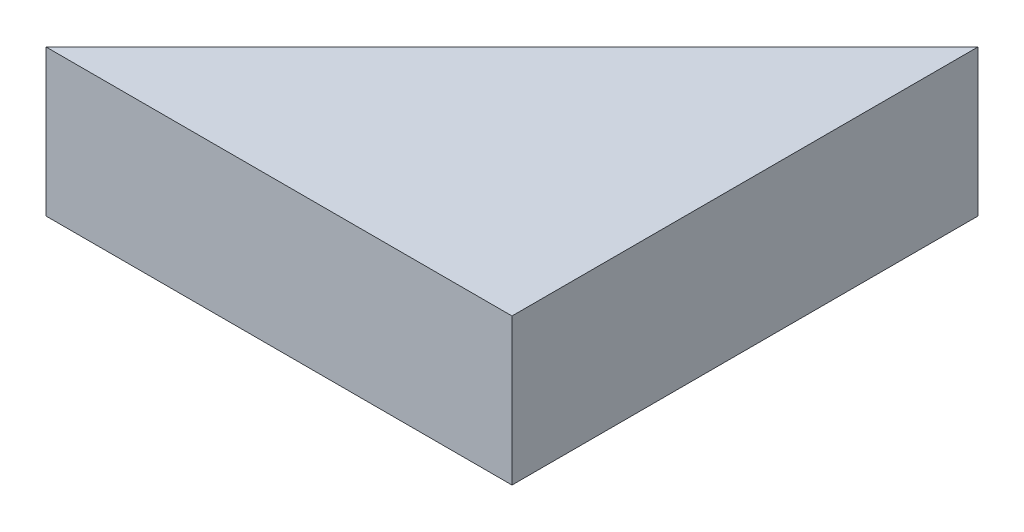
ISO-10303-21;
HEADER;
FILE_DESCRIPTION(('STEP AP214'),'2;1');
FILE_NAME('part.step','',(''),(''),'','','');
FILE_SCHEMA(('AUTOMOTIVE_DESIGN { 1 0 10303 214 1 1 1 1 }'));
ENDSEC;
DATA;
#1=APPLICATION_CONTEXT('core data for automotive mechanical design processes');
#2=APPLICATION_PROTOCOL_DEFINITION('international standard','automotive_design',2000,#1);
#3=PRODUCT_CONTEXT('',#1,'mechanical');
#4=PRODUCT('Part','Part','',(#3));
#5=PRODUCT_RELATED_PRODUCT_CATEGORY('part','',(#4));
#6=PRODUCT_DEFINITION_FORMATION('','',#4);
#7=PRODUCT_DEFINITION_CONTEXT('part definition',#1,'design');
#8=PRODUCT_DEFINITION('design','',#6,#7);
#9=PRODUCT_DEFINITION_SHAPE('','',#8);
#10=(LENGTH_UNIT() NAMED_UNIT(*) SI_UNIT(.MILLI.,.METRE.));
#11=(NAMED_UNIT(*) PLANE_ANGLE_UNIT() SI_UNIT($,.RADIAN.));
#12=(NAMED_UNIT(*) SI_UNIT($,.STERADIAN.) SOLID_ANGLE_UNIT());
#13=UNCERTAINTY_MEASURE_WITH_UNIT(LENGTH_MEASURE(1.E-05),#10,'distance_accuracy_value','');
#14=(GEOMETRIC_REPRESENTATION_CONTEXT(3) GLOBAL_UNCERTAINTY_ASSIGNED_CONTEXT((#13)) GLOBAL_UNIT_ASSIGNED_CONTEXT((#10,
#11,#12)) REPRESENTATION_CONTEXT('',''));
#15=CARTESIAN_POINT('',(0.,0.,0.));
#16=DIRECTION('',(0.,0.,1.));
#17=DIRECTION('',(1.,0.,0.));
#18=AXIS2_PLACEMENT_3D('',#15,#16,#17);
#19=CARTESIAN_POINT('',(-57.,-11.,35.));
#20=DIRECTION('',(0.,-1.,0.));
#21=DIRECTION('',(0.,0.,-1.));
#22=AXIS2_PLACEMENT_3D('',#19,#20,#21);
#23=PLANE('',#22);
#24=DIRECTION('',(0.,0.,1.));
#25=VECTOR('',#24,1.);
#26=CARTESIAN_POINT('',(-22.,-11.,70.));
#27=LINE('',#26,#25);
#28=CARTESIAN_POINT('',(-22.,-11.,0.));
#29=VERTEX_POINT('',#28);
#30=CARTESIAN_POINT('',(-22.,-11.,70.));
#31=VERTEX_POINT('',#30);
#32=EDGE_CURVE('E11',#29,#31,#27,.T.);
#33=ORIENTED_EDGE('',*,*,#32,.T.);
#34=DIRECTION('',(-1.,0.,0.));
#35=VECTOR('',#34,1.);
#36=CARTESIAN_POINT('',(-22.,-11.,70.));
#37=LINE('',#36,#35);
#38=CARTESIAN_POINT('',(-92.,-11.,70.));
#39=VERTEX_POINT('',#38);
#40=EDGE_CURVE('E27',#31,#39,#37,.T.);
#41=ORIENTED_EDGE('',*,*,#40,.T.);
#42=DIRECTION('',(0.707106781186547,0.,-0.707106781186548));
#43=VECTOR('',#42,1.);
#44=CARTESIAN_POINT('',(-22.,-11.,0.));
#45=LINE('',#44,#43);
#46=EDGE_CURVE('E55',#39,#29,#45,.T.);
#47=ORIENTED_EDGE('',*,*,#46,.T.);
#48=EDGE_LOOP('',(#33,#41,#47));
#49=FACE_BOUND('',#48,.T.);
#50=ADVANCED_FACE('F16',(#49),#23,.T.);
#51=CARTESIAN_POINT('',(-92.,0.,70.));
#52=DIRECTION('',(0.,0.,1.));
#53=DIRECTION('',(1.,0.,0.));
#54=AXIS2_PLACEMENT_3D('',#51,#52,#53);
#55=PLANE('',#54);
#56=DIRECTION('',(0.,-1.,0.));
#57=VECTOR('',#56,1.);
#58=CARTESIAN_POINT('',(-22.,0.,70.));
#59=LINE('',#58,#57);
#60=CARTESIAN_POINT('',(-22.,11.,70.));
#61=VERTEX_POINT('',#60);
#62=EDGE_CURVE('E70',#61,#31,#59,.T.);
#63=ORIENTED_EDGE('',*,*,#62,.F.);
#64=DIRECTION('',(1.,0.,0.));
#65=VECTOR('',#64,1.);
#66=CARTESIAN_POINT('',(-22.,11.,70.));
#67=LINE('',#66,#65);
#68=CARTESIAN_POINT('',(-92.,11.,70.));
#69=VERTEX_POINT('',#68);
#70=EDGE_CURVE('E64',#69,#61,#67,.T.);
#71=ORIENTED_EDGE('',*,*,#70,.F.);
#72=DIRECTION('',(0.,1.,0.));
#73=VECTOR('',#72,1.);
#74=CARTESIAN_POINT('',(-92.,0.,70.));
#75=LINE('',#74,#73);
#76=EDGE_CURVE('E68',#39,#69,#75,.T.);
#77=ORIENTED_EDGE('',*,*,#76,.F.);
#78=ORIENTED_EDGE('',*,*,#40,.F.);
#79=EDGE_LOOP('',(#63,#71,#77,#78));
#80=FACE_BOUND('',#79,.T.);
#81=ADVANCED_FACE('F67',(#80),#55,.T.);
#82=CARTESIAN_POINT('',(-22.,0.,0.));
#83=DIRECTION('',(-0.707106781186548,0.,-0.707106781186547));
#84=DIRECTION('',(-0.707106781186547,0.,0.707106781186548));
#85=AXIS2_PLACEMENT_3D('',#82,#83,#84);
#86=PLANE('',#85);
#87=ORIENTED_EDGE('',*,*,#76,.T.);
#88=DIRECTION('',(-0.707106781186547,0.,0.707106781186548));
#89=VECTOR('',#88,1.);
#90=CARTESIAN_POINT('',(-22.,11.,0.));
#91=LINE('',#90,#89);
#92=CARTESIAN_POINT('',(-22.,11.,0.));
#93=VERTEX_POINT('',#92);
#94=EDGE_CURVE('E73',#93,#69,#91,.T.);
#95=ORIENTED_EDGE('',*,*,#94,.F.);
#96=DIRECTION('',(0.,1.,0.));
#97=VECTOR('',#96,1.);
#98=CARTESIAN_POINT('',(-22.,0.,0.));
#99=LINE('',#98,#97);
#100=EDGE_CURVE('E20',#29,#93,#99,.T.);
#101=ORIENTED_EDGE('',*,*,#100,.F.);
#102=ORIENTED_EDGE('',*,*,#46,.F.);
#103=EDGE_LOOP('',(#87,#95,#101,#102));
#104=FACE_BOUND('',#103,.T.);
#105=ADVANCED_FACE('F76',(#104),#86,.T.);
#106=CARTESIAN_POINT('',(-22.,0.,70.));
#107=DIRECTION('',(1.,0.,0.));
#108=DIRECTION('',(0.,0.,-1.));
#109=AXIS2_PLACEMENT_3D('',#106,#107,#108);
#110=PLANE('',#109);
#111=ORIENTED_EDGE('',*,*,#100,.T.);
#112=DIRECTION('',(0.,0.,-1.));
#113=VECTOR('',#112,1.);
#114=CARTESIAN_POINT('',(-22.,11.,70.));
#115=LINE('',#114,#113);
#116=EDGE_CURVE('E81',#61,#93,#115,.T.);
#117=ORIENTED_EDGE('',*,*,#116,.F.);
#118=ORIENTED_EDGE('',*,*,#62,.T.);
#119=ORIENTED_EDGE('',*,*,#32,.F.);
#120=EDGE_LOOP('',(#111,#117,#118,#119));
#121=FACE_BOUND('',#120,.T.);
#122=ADVANCED_FACE('F98',(#121),#110,.T.);
#123=CARTESIAN_POINT('',(-57.,11.,35.));
#124=DIRECTION('',(0.,1.,0.));
#125=DIRECTION('',(1.,0.,0.));
#126=AXIS2_PLACEMENT_3D('',#123,#124,#125);
#127=PLANE('',#126);
#128=ORIENTED_EDGE('',*,*,#116,.T.);
#129=ORIENTED_EDGE('',*,*,#94,.T.);
#130=ORIENTED_EDGE('',*,*,#70,.T.);
#131=EDGE_LOOP('',(#128,#129,#130));
#132=FACE_BOUND('',#131,.T.);
#133=ADVANCED_FACE('F18',(#132),#127,.T.);
#134=CLOSED_SHELL('',(#50,#81,#105,#122,#133));
#135=MANIFOLD_SOLID_BREP('B1',#134);
#136=ADVANCED_BREP_SHAPE_REPRESENTATION('',(#18,#135),#14);
#137=SHAPE_DEFINITION_REPRESENTATION(#9,#136);
ENDSEC;
END-ISO-10303-21;
